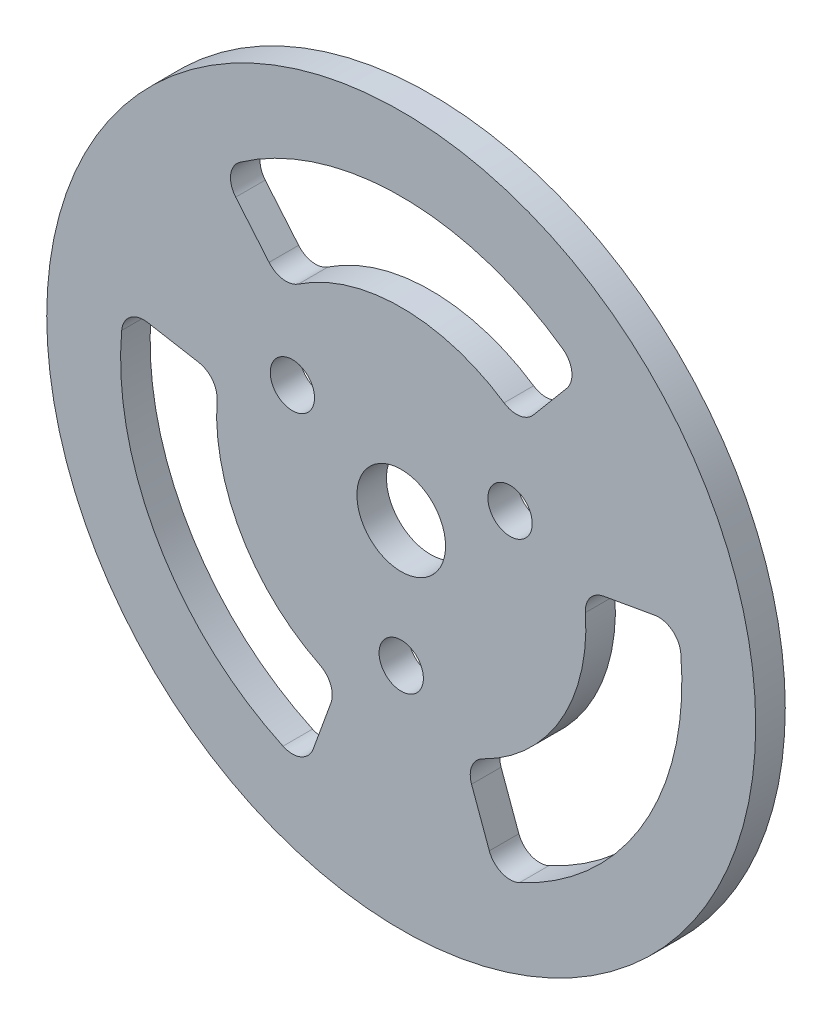
ISO-10303-21;
HEADER;
FILE_DESCRIPTION(('STEP AP214'),'2;1');
FILE_NAME('part.step','',(''),(''),'','','');
FILE_SCHEMA(('AUTOMOTIVE_DESIGN { 1 0 10303 214 1 1 1 1 }'));
ENDSEC;
DATA;
#1=APPLICATION_CONTEXT('core data for automotive mechanical design processes');
#2=APPLICATION_PROTOCOL_DEFINITION('international standard','automotive_design',2000,#1);
#3=PRODUCT_CONTEXT('',#1,'mechanical');
#4=PRODUCT('Part','Part','',(#3));
#5=PRODUCT_RELATED_PRODUCT_CATEGORY('part','',(#4));
#6=PRODUCT_DEFINITION_FORMATION('','',#4);
#7=PRODUCT_DEFINITION_CONTEXT('part definition',#1,'design');
#8=PRODUCT_DEFINITION('design','',#6,#7);
#9=PRODUCT_DEFINITION_SHAPE('','',#8);
#10=(LENGTH_UNIT() NAMED_UNIT(*) SI_UNIT(.MILLI.,.METRE.));
#11=(NAMED_UNIT(*) PLANE_ANGLE_UNIT() SI_UNIT($,.RADIAN.));
#12=(NAMED_UNIT(*) SI_UNIT($,.STERADIAN.) SOLID_ANGLE_UNIT());
#13=UNCERTAINTY_MEASURE_WITH_UNIT(LENGTH_MEASURE(1.E-05),#10,'distance_accuracy_value','');
#14=(GEOMETRIC_REPRESENTATION_CONTEXT(3) GLOBAL_UNCERTAINTY_ASSIGNED_CONTEXT((#13)) GLOBAL_UNIT_ASSIGNED_CONTEXT((#10,
#11,#12)) REPRESENTATION_CONTEXT('',''));
#15=CARTESIAN_POINT('',(0.,0.,0.));
#16=DIRECTION('',(0.,0.,1.));
#17=DIRECTION('',(1.,0.,0.));
#18=AXIS2_PLACEMENT_3D('',#15,#16,#17);
#19=CARTESIAN_POINT('',(0.,0.,2.));
#20=DIRECTION('',(0.,0.,1.));
#21=DIRECTION('',(1.,0.,0.));
#22=AXIS2_PLACEMENT_3D('',#19,#20,#21);
#23=PLANE('',#22);
#24=CARTESIAN_POINT('',(7.3684325591274,4.25416652151843,2.));
#25=DIRECTION('',(0.,0.,1.));
#26=DIRECTION('',(1.,0.,0.));
#27=AXIS2_PLACEMENT_3D('',#24,#25,#26);
#28=CIRCLE('',#27,1.50000000000063);
#29=CARTESIAN_POINT('',(8.86843255912803,4.25416652151843,2.));
#30=VERTEX_POINT('',#29);
#31=EDGE_CURVE('E750',#30,#30,#28,.T.);
#32=ORIENTED_EDGE('',*,*,#31,.F.);
#33=EDGE_LOOP('',(#32));
#34=FACE_BOUND('',#33,.T.);
#35=CARTESIAN_POINT('',(0.,0.,2.));
#36=DIRECTION('',(0.,0.,1.));
#37=DIRECTION('',(1.,0.,0.));
#38=AXIS2_PLACEMENT_3D('',#35,#36,#37);
#39=CIRCLE('',#38,3.);
#40=CARTESIAN_POINT('',(3.,0.,2.));
#41=VERTEX_POINT('',#40);
#42=EDGE_CURVE('E429',#41,#41,#39,.T.);
#43=ORIENTED_EDGE('',*,*,#42,.F.);
#44=EDGE_LOOP('',(#43));
#45=FACE_BOUND('',#44,.T.);
#46=CARTESIAN_POINT('',(0.,0.,2.));
#47=DIRECTION('',(0.,0.,1.));
#48=DIRECTION('',(1.,0.,0.));
#49=AXIS2_PLACEMENT_3D('',#46,#47,#48);
#50=CIRCLE('',#49,24.);
#51=CARTESIAN_POINT('',(24.,0.,2.));
#52=VERTEX_POINT('',#51);
#53=EDGE_CURVE('E230',#52,#52,#50,.T.);
#54=ORIENTED_EDGE('',*,*,#53,.T.);
#55=EDGE_LOOP('',(#54));
#56=FACE_BOUND('',#55,.T.);
#57=CARTESIAN_POINT('',(-7.3684325591274,4.25416652151781,2.));
#58=DIRECTION('',(0.,0.,1.));
#59=DIRECTION('',(1.,0.,0.));
#60=AXIS2_PLACEMENT_3D('',#57,#58,#59);
#61=CIRCLE('',#60,1.5);
#62=CARTESIAN_POINT('',(-5.8684325591274,4.25416652151781,2.));
#63=VERTEX_POINT('',#62);
#64=EDGE_CURVE('E421',#63,#63,#61,.T.);
#65=ORIENTED_EDGE('',*,*,#64,.F.);
#66=EDGE_LOOP('',(#65));
#67=FACE_BOUND('',#66,.T.);
#68=DIRECTION('',(0.642787609686539,0.766044443118978,0.));
#69=VECTOR('',#68,1.);
#70=CARTESIAN_POINT('',(8.03484512108152,9.57555553898741,2.));
#71=LINE('',#70,#69);
#72=CARTESIAN_POINT('',(8.94722486520327,10.6628873768547,2.));
#73=VERTEX_POINT('',#72);
#74=CARTESIAN_POINT('',(11.2073849311345,13.3564412552662,2.));
#75=VERTEX_POINT('',#74);
#76=EDGE_CURVE('E394',#73,#75,#71,.T.);
#77=ORIENTED_EDGE('',*,*,#76,.F.);
#78=CARTESIAN_POINT('',(7.79815820052481,11.6270687913845,2.));
#79=DIRECTION('',(0.,0.,1.));
#80=DIRECTION('',(1.,0.,0.));
#81=AXIS2_PLACEMENT_3D('',#78,#79,#80);
#82=CIRCLE('',#81,1.5);
#83=CARTESIAN_POINT('',(6.96264125046858,10.381311420879,2.));
#84=VERTEX_POINT('',#83);
#85=EDGE_CURVE('E373',#73,#84,#82,.F.);
#86=ORIENTED_EDGE('',*,*,#85,.T.);
#87=CARTESIAN_POINT('',(0.,0.,2.));
#88=DIRECTION('',(0.,0.,-1.));
#89=DIRECTION('',(1.,0.,0.));
#90=AXIS2_PLACEMENT_3D('',#87,#88,#89);
#91=CIRCLE('',#90,12.5);
#92=CARTESIAN_POINT('',(-6.96264125046902,10.3813114208787,2.));
#93=VERTEX_POINT('',#92);
#94=EDGE_CURVE('E398',#93,#84,#91,.T.);
#95=ORIENTED_EDGE('',*,*,#94,.F.);
#96=CARTESIAN_POINT('',(-7.7981582005253,11.6270687913842,2.));
#97=DIRECTION('',(0.,0.,1.));
#98=DIRECTION('',(1.,0.,0.));
#99=AXIS2_PLACEMENT_3D('',#96,#97,#98);
#100=CIRCLE('',#99,1.5);
#101=CARTESIAN_POINT('',(-8.94722486520377,10.6628873768544,2.));
#102=VERTEX_POINT('',#101);
#103=EDGE_CURVE('E367',#93,#102,#100,.F.);
#104=ORIENTED_EDGE('',*,*,#103,.T.);
#105=DIRECTION('',(0.642787609686539,-0.766044443118978,0.));
#106=VECTOR('',#105,1.);
#107=CARTESIAN_POINT('',(-8.03484512108197,9.57555553898704,2.));
#108=LINE('',#107,#106);
#109=CARTESIAN_POINT('',(-11.2073849311349,13.3564412552658,2.));
#110=VERTEX_POINT('',#109);
#111=EDGE_CURVE('E402',#110,#102,#108,.T.);
#112=ORIENTED_EDGE('',*,*,#111,.F.);
#113=CARTESIAN_POINT('',(-10.0583182664565,14.3206226697956,2.));
#114=DIRECTION('',(0.,0.,1.));
#115=DIRECTION('',(1.,0.,0.));
#116=AXIS2_PLACEMENT_3D('',#113,#114,#115);
#117=CIRCLE('',#116,1.5);
#118=CARTESIAN_POINT('',(-10.9204598321528,15.548104612921,2.));
#119=VERTEX_POINT('',#118);
#120=EDGE_CURVE('E361',#110,#119,#117,.F.);
#121=ORIENTED_EDGE('',*,*,#120,.T.);
#122=CARTESIAN_POINT('',(0.,0.,2.));
#123=DIRECTION('',(0.,0.,1.));
#124=DIRECTION('',(1.,0.,0.));
#125=AXIS2_PLACEMENT_3D('',#122,#123,#124);
#126=CIRCLE('',#125,18.9999999999999);
#127=CARTESIAN_POINT('',(10.9204598321522,15.5481046129213,2.));
#128=VERTEX_POINT('',#127);
#129=EDGE_CURVE('E397',#128,#119,#126,.T.);
#130=ORIENTED_EDGE('',*,*,#129,.F.);
#131=CARTESIAN_POINT('',(10.058318266456,14.320622669796,2.));
#132=DIRECTION('',(0.,0.,1.));
#133=DIRECTION('',(1.,0.,0.));
#134=AXIS2_PLACEMENT_3D('',#131,#132,#133);
#135=CIRCLE('',#134,1.5);
#136=EDGE_CURVE('E11',#128,#75,#135,.F.);
#137=ORIENTED_EDGE('',*,*,#136,.T.);
#138=EDGE_LOOP('',(#77,#86,#95,#104,#112,#121,#130,#137));
#139=FACE_BOUND('',#138,.T.);
#140=DIRECTION('',(0.342020143325669,-0.939692620785908,0.));
#141=VECTOR('',#140,1.);
#142=CARTESIAN_POINT('',(4.27525179157306,-11.7461577598229,2.));
#143=LINE('',#142,#141);
#144=CARTESIAN_POINT('',(4.76071891344883,-13.0799677150642,2.));
#145=VERTEX_POINT('',#144);
#146=CARTESIAN_POINT('',(5.96332496564971,-16.3841006879855,2.));
#147=VERTEX_POINT('',#146);
#148=EDGE_CURVE('E793',#145,#147,#143,.T.);
#149=ORIENTED_EDGE('',*,*,#148,.F.);
#150=CARTESIAN_POINT('',(6.17025784462769,-12.5669375000757,2.));
#151=DIRECTION('',(0.,0.,1.));
#152=DIRECTION('',(1.,0.,0.));
#153=AXIS2_PLACEMENT_3D('',#150,#151,#152);
#154=CIRCLE('',#153,1.5);
#155=CARTESIAN_POINT('',(5.50915878984615,-11.2204799107818,2.));
#156=VERTEX_POINT('',#155);
#157=EDGE_CURVE('E355',#145,#156,#154,.F.);
#158=ORIENTED_EDGE('',*,*,#157,.T.);
#159=CARTESIAN_POINT('',(0.,0.,2.));
#160=DIRECTION('',(0.,0.,-1.));
#161=DIRECTION('',(1.,0.,0.));
#162=AXIS2_PLACEMENT_3D('',#159,#160,#161);
#163=CIRCLE('',#162,12.4999999999999);
#164=CARTESIAN_POINT('',(12.4718000403129,0.839168489904891,2.));
#165=VERTEX_POINT('',#164);
#166=EDGE_CURVE('E789',#165,#156,#163,.T.);
#167=ORIENTED_EDGE('',*,*,#166,.F.);
#168=CARTESIAN_POINT('',(13.9684160451504,0.939868708693479,2.));
#169=DIRECTION('',(0.,0.,1.));
#170=DIRECTION('',(1.,0.,0.));
#171=AXIS2_PLACEMENT_3D('',#168,#169,#170);
#172=CIRCLE('',#171,1.5);
#173=CARTESIAN_POINT('',(13.70794377865,2.41708033821179,2.));
#174=VERTEX_POINT('',#173);
#175=EDGE_CURVE('E337',#165,#174,#172,.F.);
#176=ORIENTED_EDGE('',*,*,#175,.T.);
#177=DIRECTION('',(-0.984807753012208,-0.173648177666931,0.));
#178=VECTOR('',#177,1.);
#179=CARTESIAN_POINT('',(12.3100969126524,2.17060222083764,2.));
#180=LINE('',#179,#178);
#181=CARTESIAN_POINT('',(17.1707098967821,3.02765943272159,2.));
#182=VERTEX_POINT('',#181);
#183=EDGE_CURVE('E416',#182,#174,#180,.T.);
#184=ORIENTED_EDGE('',*,*,#183,.F.);
#185=CARTESIAN_POINT('',(17.4311821632825,1.55044780320328,2.));
#186=DIRECTION('',(0.,0.,1.));
#187=DIRECTION('',(1.,0.,0.));
#188=AXIS2_PLACEMENT_3D('',#185,#186,#187);
#189=CIRCLE('',#188,1.5);
#190=CARTESIAN_POINT('',(18.9252834915639,1.68334332919214,2.));
#191=VERTEX_POINT('',#190);
#192=EDGE_CURVE('E343',#182,#191,#189,.F.);
#193=ORIENTED_EDGE('',*,*,#192,.T.);
#194=CARTESIAN_POINT('',(0.,0.,2.));
#195=DIRECTION('',(0.,0.,1.));
#196=DIRECTION('',(1.,0.,0.));
#197=AXIS2_PLACEMENT_3D('',#194,#195,#196);
#198=CIRCLE('',#197,18.9999999999999);
#199=CARTESIAN_POINT('',(8.00482365941388,-17.2314479421111,2.));
#200=VERTEX_POINT('',#199);
#201=EDGE_CURVE('E798',#200,#191,#198,.T.);
#202=ORIENTED_EDGE('',*,*,#201,.F.);
#203=CARTESIAN_POINT('',(7.37286389682857,-15.871070472997,2.));
#204=DIRECTION('',(0.,0.,1.));
#205=DIRECTION('',(1.,0.,0.));
#206=AXIS2_PLACEMENT_3D('',#203,#204,#205);
#207=CIRCLE('',#206,1.5);
#208=EDGE_CURVE('E349',#200,#147,#207,.F.);
#209=ORIENTED_EDGE('',*,*,#208,.T.);
#210=EDGE_LOOP('',(#149,#158,#167,#176,#184,#193,#202,#209));
#211=FACE_BOUND('',#210,.T.);
#212=DIRECTION('',(-0.984807753012208,0.17364817766693,0.));
#213=VECTOR('',#212,1.);
#214=CARTESIAN_POINT('',(-12.3100969126523,2.17060222083553,2.));
#215=LINE('',#214,#213);
#216=CARTESIAN_POINT('',(-13.7079437786498,2.41708033820966,2.));
#217=VERTEX_POINT('',#216);
#218=CARTESIAN_POINT('',(-17.1707098967821,3.0276594327195,2.));
#219=VERTEX_POINT('',#218);
#220=EDGE_CURVE('E770',#217,#219,#215,.T.);
#221=ORIENTED_EDGE('',*,*,#220,.F.);
#222=CARTESIAN_POINT('',(-13.9684160451502,0.939868708691351,2.));
#223=DIRECTION('',(0.,0.,1.));
#224=DIRECTION('',(1.,0.,0.));
#225=AXIS2_PLACEMENT_3D('',#222,#223,#224);
#226=CIRCLE('',#225,1.5);
#227=CARTESIAN_POINT('',(-12.4718000403126,0.839168489902988,2.));
#228=VERTEX_POINT('',#227);
#229=EDGE_CURVE('E214',#217,#228,#226,.F.);
#230=ORIENTED_EDGE('',*,*,#229,.T.);
#231=CARTESIAN_POINT('',(0.,0.,2.));
#232=DIRECTION('',(0.,0.,-1.));
#233=DIRECTION('',(1.,0.,0.));
#234=AXIS2_PLACEMENT_3D('',#231,#232,#233);
#235=CIRCLE('',#234,12.4999999999995);
#236=CARTESIAN_POINT('',(-5.50915878984214,-11.2204799107834,2.));
#237=VERTEX_POINT('',#236);
#238=EDGE_CURVE('E766',#237,#228,#235,.T.);
#239=ORIENTED_EDGE('',*,*,#238,.F.);
#240=CARTESIAN_POINT('',(-6.17025784462322,-12.5669375000774,2.));
#241=DIRECTION('',(0.,0.,1.));
#242=DIRECTION('',(1.,0.,0.));
#243=AXIS2_PLACEMENT_3D('',#240,#241,#242);
#244=CIRCLE('',#243,1.5);
#245=CARTESIAN_POINT('',(-4.76071891344436,-13.079967715066,2.));
#246=VERTEX_POINT('',#245);
#247=EDGE_CURVE('E324',#237,#246,#244,.F.);
#248=ORIENTED_EDGE('',*,*,#247,.T.);
#249=DIRECTION('',(0.342020143325669,0.939692620785908,0.));
#250=VECTOR('',#249,1.);
#251=CARTESIAN_POINT('',(-4.27525179156845,-11.7461577598243,2.));
#252=LINE('',#251,#250);
#253=CARTESIAN_POINT('',(-5.96332496564526,-16.3841006879874,2.));
#254=VERTEX_POINT('',#253);
#255=EDGE_CURVE('E777',#254,#246,#252,.T.);
#256=ORIENTED_EDGE('',*,*,#255,.F.);
#257=CARTESIAN_POINT('',(-7.37286389682412,-15.8710704729989,2.));
#258=DIRECTION('',(0.,0.,1.));
#259=DIRECTION('',(1.,0.,0.));
#260=AXIS2_PLACEMENT_3D('',#257,#258,#259);
#261=CIRCLE('',#260,1.5);
#262=CARTESIAN_POINT('',(-8.00482365940905,-17.2314479421131,2.));
#263=VERTEX_POINT('',#262);
#264=EDGE_CURVE('E318',#254,#263,#261,.F.);
#265=ORIENTED_EDGE('',*,*,#264,.T.);
#266=CARTESIAN_POINT('',(0.,0.,2.));
#267=DIRECTION('',(0.,0.,1.));
#268=DIRECTION('',(1.,0.,0.));
#269=AXIS2_PLACEMENT_3D('',#266,#267,#268);
#270=CIRCLE('',#269,18.9999999999997);
#271=CARTESIAN_POINT('',(-18.9252834915639,1.68334332918986,2.));
#272=VERTEX_POINT('',#271);
#273=EDGE_CURVE('E774',#272,#263,#270,.T.);
#274=ORIENTED_EDGE('',*,*,#273,.F.);
#275=CARTESIAN_POINT('',(-17.4311821632825,1.55044780320119,2.));
#276=DIRECTION('',(0.,0.,1.));
#277=DIRECTION('',(1.,0.,0.));
#278=AXIS2_PLACEMENT_3D('',#275,#276,#277);
#279=CIRCLE('',#278,1.5);
#280=EDGE_CURVE('E213',#272,#219,#279,.F.);
#281=ORIENTED_EDGE('',*,*,#280,.T.);
#282=EDGE_LOOP('',(#221,#230,#239,#248,#256,#265,#274,#281));
#283=FACE_BOUND('',#282,.T.);
#284=CARTESIAN_POINT('',(5.4138210334093E-13,-8.5083330430353,2.));
#285=DIRECTION('',(0.,0.,1.));
#286=DIRECTION('',(1.,0.,0.));
#287=AXIS2_PLACEMENT_3D('',#284,#285,#286);
#288=CIRCLE('',#287,1.50000000000024);
#289=CARTESIAN_POINT('',(1.50000000000078,-8.5083330430353,2.));
#290=VERTEX_POINT('',#289);
#291=EDGE_CURVE('E755',#290,#290,#288,.T.);
#292=ORIENTED_EDGE('',*,*,#291,.F.);
#293=EDGE_LOOP('',(#292));
#294=FACE_BOUND('',#293,.T.);
#295=ADVANCED_FACE('F38',(#34,#45,#56,#67,#139,#211,#283,#294),#23,.T.);
#296=CARTESIAN_POINT('',(0.,0.,0.));
#297=DIRECTION('',(0.,0.,1.));
#298=DIRECTION('',(1.,0.,0.));
#299=AXIS2_PLACEMENT_3D('',#296,#297,#298);
#300=PLANE('',#299);
#301=DIRECTION('',(-0.984807753012208,-0.173648177666931,0.));
#302=VECTOR('',#301,1.);
#303=CARTESIAN_POINT('',(12.3100969126524,2.17060222083764,0.));
#304=LINE('',#303,#302);
#305=CARTESIAN_POINT('',(17.1707098967821,3.02765943272159,0.));
#306=VERTEX_POINT('',#305);
#307=CARTESIAN_POINT('',(13.70794377865,2.41708033821179,0.));
#308=VERTEX_POINT('',#307);
#309=EDGE_CURVE('E794',#306,#308,#304,.T.);
#310=ORIENTED_EDGE('',*,*,#309,.T.);
#311=CARTESIAN_POINT('',(13.9684160451504,0.939868708693479,0.));
#312=DIRECTION('',(0.,0.,1.));
#313=DIRECTION('',(1.,0.,0.));
#314=AXIS2_PLACEMENT_3D('',#311,#312,#313);
#315=CIRCLE('',#314,1.5);
#316=CARTESIAN_POINT('',(12.4718000403129,0.839168489904891,0.));
#317=VERTEX_POINT('',#316);
#318=EDGE_CURVE('E334',#308,#317,#315,.T.);
#319=ORIENTED_EDGE('',*,*,#318,.T.);
#320=CARTESIAN_POINT('',(0.,0.,0.));
#321=DIRECTION('',(0.,0.,-1.));
#322=DIRECTION('',(1.,0.,0.));
#323=AXIS2_PLACEMENT_3D('',#320,#321,#322);
#324=CIRCLE('',#323,12.4999999999999);
#325=CARTESIAN_POINT('',(5.50915878984615,-11.2204799107818,0.));
#326=VERTEX_POINT('',#325);
#327=EDGE_CURVE('E781',#317,#326,#324,.T.);
#328=ORIENTED_EDGE('',*,*,#327,.T.);
#329=CARTESIAN_POINT('',(6.17025784462769,-12.5669375000757,0.));
#330=DIRECTION('',(0.,0.,1.));
#331=DIRECTION('',(1.,0.,0.));
#332=AXIS2_PLACEMENT_3D('',#329,#330,#331);
#333=CIRCLE('',#332,1.5);
#334=CARTESIAN_POINT('',(4.76071891344883,-13.0799677150642,0.));
#335=VERTEX_POINT('',#334);
#336=EDGE_CURVE('E352',#326,#335,#333,.T.);
#337=ORIENTED_EDGE('',*,*,#336,.T.);
#338=DIRECTION('',(0.342020143325669,-0.939692620785908,0.));
#339=VECTOR('',#338,1.);
#340=CARTESIAN_POINT('',(4.27525179157306,-11.7461577598229,0.));
#341=LINE('',#340,#339);
#342=CARTESIAN_POINT('',(5.96332496564971,-16.3841006879855,0.));
#343=VERTEX_POINT('',#342);
#344=EDGE_CURVE('E808',#335,#343,#341,.T.);
#345=ORIENTED_EDGE('',*,*,#344,.T.);
#346=CARTESIAN_POINT('',(7.37286389682857,-15.871070472997,0.));
#347=DIRECTION('',(0.,0.,1.));
#348=DIRECTION('',(1.,0.,0.));
#349=AXIS2_PLACEMENT_3D('',#346,#347,#348);
#350=CIRCLE('',#349,1.5);
#351=CARTESIAN_POINT('',(8.00482365941388,-17.2314479421111,0.));
#352=VERTEX_POINT('',#351);
#353=EDGE_CURVE('E346',#343,#352,#350,.T.);
#354=ORIENTED_EDGE('',*,*,#353,.T.);
#355=CARTESIAN_POINT('',(0.,0.,0.));
#356=DIRECTION('',(0.,0.,1.));
#357=DIRECTION('',(1.,0.,0.));
#358=AXIS2_PLACEMENT_3D('',#355,#356,#357);
#359=CIRCLE('',#358,18.9999999999999);
#360=CARTESIAN_POINT('',(18.9252834915639,1.68334332919214,0.));
#361=VERTEX_POINT('',#360);
#362=EDGE_CURVE('E812',#352,#361,#359,.T.);
#363=ORIENTED_EDGE('',*,*,#362,.T.);
#364=CARTESIAN_POINT('',(17.4311821632825,1.55044780320328,0.));
#365=DIRECTION('',(0.,0.,1.));
#366=DIRECTION('',(1.,0.,0.));
#367=AXIS2_PLACEMENT_3D('',#364,#365,#366);
#368=CIRCLE('',#367,1.5);
#369=EDGE_CURVE('E340',#361,#306,#368,.T.);
#370=ORIENTED_EDGE('',*,*,#369,.T.);
#371=EDGE_LOOP('',(#310,#319,#328,#337,#345,#354,#363,#370));
#372=FACE_BOUND('',#371,.T.);
#373=CARTESIAN_POINT('',(-7.3684325591274,4.25416652151781,0.));
#374=DIRECTION('',(0.,0.,1.));
#375=DIRECTION('',(1.,0.,0.));
#376=AXIS2_PLACEMENT_3D('',#373,#374,#375);
#377=CIRCLE('',#376,1.5);
#378=CARTESIAN_POINT('',(-5.8684325591274,4.25416652151781,0.));
#379=VERTEX_POINT('',#378);
#380=EDGE_CURVE('E411',#379,#379,#377,.T.);
#381=ORIENTED_EDGE('',*,*,#380,.T.);
#382=EDGE_LOOP('',(#381));
#383=FACE_BOUND('',#382,.T.);
#384=CARTESIAN_POINT('',(0.,0.,0.));
#385=DIRECTION('',(0.,0.,1.));
#386=DIRECTION('',(1.,0.,0.));
#387=AXIS2_PLACEMENT_3D('',#384,#385,#386);
#388=CIRCLE('',#387,3.);
#389=CARTESIAN_POINT('',(3.,0.,0.));
#390=VERTEX_POINT('',#389);
#391=EDGE_CURVE('E425',#390,#390,#388,.T.);
#392=ORIENTED_EDGE('',*,*,#391,.T.);
#393=EDGE_LOOP('',(#392));
#394=FACE_BOUND('',#393,.T.);
#395=CARTESIAN_POINT('',(0.,0.,0.));
#396=DIRECTION('',(0.,0.,1.));
#397=DIRECTION('',(1.,0.,0.));
#398=AXIS2_PLACEMENT_3D('',#395,#396,#397);
#399=CIRCLE('',#398,24.);
#400=CARTESIAN_POINT('',(24.,0.,0.));
#401=VERTEX_POINT('',#400);
#402=EDGE_CURVE('E237',#401,#401,#399,.T.);
#403=ORIENTED_EDGE('',*,*,#402,.F.);
#404=EDGE_LOOP('',(#403));
#405=FACE_BOUND('',#404,.T.);
#406=DIRECTION('',(0.642787609686539,-0.766044443118978,0.));
#407=VECTOR('',#406,1.);
#408=CARTESIAN_POINT('',(-8.03484512108197,9.57555553898704,0.));
#409=LINE('',#408,#407);
#410=CARTESIAN_POINT('',(-11.2073849311349,13.3564412552658,0.));
#411=VERTEX_POINT('',#410);
#412=CARTESIAN_POINT('',(-8.94722486520377,10.6628873768544,0.));
#413=VERTEX_POINT('',#412);
#414=EDGE_CURVE('E391',#411,#413,#409,.T.);
#415=ORIENTED_EDGE('',*,*,#414,.T.);
#416=CARTESIAN_POINT('',(-7.7981582005253,11.6270687913842,0.));
#417=DIRECTION('',(0.,0.,1.));
#418=DIRECTION('',(1.,0.,0.));
#419=AXIS2_PLACEMENT_3D('',#416,#417,#418);
#420=CIRCLE('',#419,1.5);
#421=CARTESIAN_POINT('',(-6.96264125046902,10.3813114208787,0.));
#422=VERTEX_POINT('',#421);
#423=EDGE_CURVE('E364',#413,#422,#420,.T.);
#424=ORIENTED_EDGE('',*,*,#423,.T.);
#425=CARTESIAN_POINT('',(0.,0.,0.));
#426=DIRECTION('',(0.,0.,-1.));
#427=DIRECTION('',(1.,0.,0.));
#428=AXIS2_PLACEMENT_3D('',#425,#426,#427);
#429=CIRCLE('',#428,12.5);
#430=CARTESIAN_POINT('',(6.96264125046858,10.381311420879,0.));
#431=VERTEX_POINT('',#430);
#432=EDGE_CURVE('E412',#422,#431,#429,.T.);
#433=ORIENTED_EDGE('',*,*,#432,.T.);
#434=CARTESIAN_POINT('',(7.79815820052481,11.6270687913845,0.));
#435=DIRECTION('',(0.,0.,1.));
#436=DIRECTION('',(1.,0.,0.));
#437=AXIS2_PLACEMENT_3D('',#434,#435,#436);
#438=CIRCLE('',#437,1.5);
#439=CARTESIAN_POINT('',(8.94722486520327,10.6628873768547,0.));
#440=VERTEX_POINT('',#439);
#441=EDGE_CURVE('E370',#431,#440,#438,.T.);
#442=ORIENTED_EDGE('',*,*,#441,.T.);
#443=DIRECTION('',(0.642787609686539,0.766044443118978,0.));
#444=VECTOR('',#443,1.);
#445=CARTESIAN_POINT('',(8.03484512108152,9.57555553898741,0.));
#446=LINE('',#445,#444);
#447=CARTESIAN_POINT('',(11.2073849311345,13.3564412552662,0.));
#448=VERTEX_POINT('',#447);
#449=EDGE_CURVE('E382',#440,#448,#446,.T.);
#450=ORIENTED_EDGE('',*,*,#449,.T.);
#451=CARTESIAN_POINT('',(10.058318266456,14.320622669796,0.));
#452=DIRECTION('',(0.,0.,1.));
#453=DIRECTION('',(1.,0.,0.));
#454=AXIS2_PLACEMENT_3D('',#451,#452,#453);
#455=CIRCLE('',#454,1.5);
#456=CARTESIAN_POINT('',(10.9204598321522,15.5481046129213,0.));
#457=VERTEX_POINT('',#456);
#458=EDGE_CURVE('E47',#448,#457,#455,.T.);
#459=ORIENTED_EDGE('',*,*,#458,.T.);
#460=CARTESIAN_POINT('',(0.,0.,0.));
#461=DIRECTION('',(0.,0.,1.));
#462=DIRECTION('',(1.,0.,0.));
#463=AXIS2_PLACEMENT_3D('',#460,#461,#462);
#464=CIRCLE('',#463,18.9999999999999);
#465=CARTESIAN_POINT('',(-10.9204598321528,15.548104612921,0.));
#466=VERTEX_POINT('',#465);
#467=EDGE_CURVE('E381',#457,#466,#464,.T.);
#468=ORIENTED_EDGE('',*,*,#467,.T.);
#469=CARTESIAN_POINT('',(-10.0583182664565,14.3206226697956,0.));
#470=DIRECTION('',(0.,0.,1.));
#471=DIRECTION('',(1.,0.,0.));
#472=AXIS2_PLACEMENT_3D('',#469,#470,#471);
#473=CIRCLE('',#472,1.5);
#474=EDGE_CURVE('E358',#466,#411,#473,.T.);
#475=ORIENTED_EDGE('',*,*,#474,.T.);
#476=EDGE_LOOP('',(#415,#424,#433,#442,#450,#459,#468,#475));
#477=FACE_BOUND('',#476,.T.);
#478=DIRECTION('',(0.342020143325669,0.939692620785908,0.));
#479=VECTOR('',#478,1.);
#480=CARTESIAN_POINT('',(-4.27525179156845,-11.7461577598243,0.));
#481=LINE('',#480,#479);
#482=CARTESIAN_POINT('',(-5.96332496564526,-16.3841006879874,0.));
#483=VERTEX_POINT('',#482);
#484=CARTESIAN_POINT('',(-4.76071891344436,-13.079967715066,0.));
#485=VERTEX_POINT('',#484);
#486=EDGE_CURVE('E225',#483,#485,#481,.T.);
#487=ORIENTED_EDGE('',*,*,#486,.T.);
#488=CARTESIAN_POINT('',(-6.17025784462322,-12.5669375000774,0.));
#489=DIRECTION('',(0.,0.,1.));
#490=DIRECTION('',(1.,0.,0.));
#491=AXIS2_PLACEMENT_3D('',#488,#489,#490);
#492=CIRCLE('',#491,1.5);
#493=CARTESIAN_POINT('',(-5.50915878984214,-11.2204799107834,0.));
#494=VERTEX_POINT('',#493);
#495=EDGE_CURVE('E321',#485,#494,#492,.T.);
#496=ORIENTED_EDGE('',*,*,#495,.T.);
#497=CARTESIAN_POINT('',(0.,0.,0.));
#498=DIRECTION('',(0.,0.,-1.));
#499=DIRECTION('',(1.,0.,0.));
#500=AXIS2_PLACEMENT_3D('',#497,#498,#499);
#501=CIRCLE('',#500,12.4999999999995);
#502=CARTESIAN_POINT('',(-12.4718000403126,0.839168489902988,0.));
#503=VERTEX_POINT('',#502);
#504=EDGE_CURVE('E759',#494,#503,#501,.T.);
#505=ORIENTED_EDGE('',*,*,#504,.T.);
#506=CARTESIAN_POINT('',(-13.9684160451502,0.939868708691351,0.));
#507=DIRECTION('',(0.,0.,1.));
#508=DIRECTION('',(1.,0.,0.));
#509=AXIS2_PLACEMENT_3D('',#506,#507,#508);
#510=CIRCLE('',#509,1.5);
#511=CARTESIAN_POINT('',(-13.7079437786498,2.41708033820966,0.));
#512=VERTEX_POINT('',#511);
#513=EDGE_CURVE('E327',#503,#512,#510,.T.);
#514=ORIENTED_EDGE('',*,*,#513,.T.);
#515=DIRECTION('',(-0.984807753012208,0.17364817766693,0.));
#516=VECTOR('',#515,1.);
#517=CARTESIAN_POINT('',(-12.3100969126523,2.17060222083553,0.));
#518=LINE('',#517,#516);
#519=CARTESIAN_POINT('',(-17.1707098967821,3.0276594327195,0.));
#520=VERTEX_POINT('',#519);
#521=EDGE_CURVE('E207',#512,#520,#518,.T.);
#522=ORIENTED_EDGE('',*,*,#521,.T.);
#523=CARTESIAN_POINT('',(-17.4311821632825,1.55044780320119,0.));
#524=DIRECTION('',(0.,0.,1.));
#525=DIRECTION('',(1.,0.,0.));
#526=AXIS2_PLACEMENT_3D('',#523,#524,#525);
#527=CIRCLE('',#526,1.5);
#528=CARTESIAN_POINT('',(-18.9252834915639,1.68334332918986,0.));
#529=VERTEX_POINT('',#528);
#530=EDGE_CURVE('E200',#520,#529,#527,.T.);
#531=ORIENTED_EDGE('',*,*,#530,.T.);
#532=CARTESIAN_POINT('',(0.,0.,0.));
#533=DIRECTION('',(0.,0.,1.));
#534=DIRECTION('',(1.,0.,0.));
#535=AXIS2_PLACEMENT_3D('',#532,#533,#534);
#536=CIRCLE('',#535,18.9999999999997);
#537=CARTESIAN_POINT('',(-8.00482365940905,-17.2314479421131,0.));
#538=VERTEX_POINT('',#537);
#539=EDGE_CURVE('E205',#529,#538,#536,.T.);
#540=ORIENTED_EDGE('',*,*,#539,.T.);
#541=CARTESIAN_POINT('',(-7.37286389682412,-15.8710704729989,0.));
#542=DIRECTION('',(0.,0.,1.));
#543=DIRECTION('',(1.,0.,0.));
#544=AXIS2_PLACEMENT_3D('',#541,#542,#543);
#545=CIRCLE('',#544,1.5);
#546=EDGE_CURVE('E315',#538,#483,#545,.T.);
#547=ORIENTED_EDGE('',*,*,#546,.T.);
#548=EDGE_LOOP('',(#487,#496,#505,#514,#522,#531,#540,#547));
#549=FACE_BOUND('',#548,.T.);
#550=CARTESIAN_POINT('',(7.3684325591274,4.25416652151843,0.));
#551=DIRECTION('',(0.,0.,1.));
#552=DIRECTION('',(1.,0.,0.));
#553=AXIS2_PLACEMENT_3D('',#550,#551,#552);
#554=CIRCLE('',#553,1.50000000000063);
#555=CARTESIAN_POINT('',(8.86843255912803,4.25416652151843,0.));
#556=VERTEX_POINT('',#555);
#557=EDGE_CURVE('E753',#556,#556,#554,.T.);
#558=ORIENTED_EDGE('',*,*,#557,.T.);
#559=EDGE_LOOP('',(#558));
#560=FACE_BOUND('',#559,.T.);
#561=CARTESIAN_POINT('',(5.4138210334093E-13,-8.5083330430353,0.));
#562=DIRECTION('',(0.,0.,1.));
#563=DIRECTION('',(1.,0.,0.));
#564=AXIS2_PLACEMENT_3D('',#561,#562,#563);
#565=CIRCLE('',#564,1.50000000000024);
#566=CARTESIAN_POINT('',(1.50000000000078,-8.5083330430353,0.));
#567=VERTEX_POINT('',#566);
#568=EDGE_CURVE('E762',#567,#567,#565,.T.);
#569=ORIENTED_EDGE('',*,*,#568,.T.);
#570=EDGE_LOOP('',(#569));
#571=FACE_BOUND('',#570,.T.);
#572=ADVANCED_FACE('F203',(#372,#383,#394,#405,#477,#549,#560,#571),#300,.F.);
#573=CARTESIAN_POINT('',(0.,0.,2.));
#574=DIRECTION('',(0.,0.,-1.));
#575=DIRECTION('',(-1.,0.,0.));
#576=AXIS2_PLACEMENT_3D('',#573,#574,#575);
#577=CYLINDRICAL_SURFACE('',#576,24.);
#578=ORIENTED_EDGE('',*,*,#53,.F.);
#579=EDGE_LOOP('',(#578));
#580=FACE_BOUND('',#579,.T.);
#581=ORIENTED_EDGE('',*,*,#402,.T.);
#582=EDGE_LOOP('',(#581));
#583=FACE_BOUND('',#582,.T.);
#584=ADVANCED_FACE('F442',(#580,#583),#577,.T.);
#585=CARTESIAN_POINT('',(0.,0.,2.));
#586=DIRECTION('',(0.,0.,-1.));
#587=DIRECTION('',(-1.,0.,0.));
#588=AXIS2_PLACEMENT_3D('',#585,#586,#587);
#589=CYLINDRICAL_SURFACE('',#588,3.);
#590=ORIENTED_EDGE('',*,*,#42,.T.);
#591=EDGE_LOOP('',(#590));
#592=FACE_BOUND('',#591,.T.);
#593=ORIENTED_EDGE('',*,*,#391,.F.);
#594=EDGE_LOOP('',(#593));
#595=FACE_BOUND('',#594,.T.);
#596=ADVANCED_FACE('F439',(#592,#595),#589,.F.);
#597=CARTESIAN_POINT('',(-7.3684325591274,4.25416652151781,2.));
#598=DIRECTION('',(0.,0.,-1.));
#599=DIRECTION('',(-1.,0.,0.));
#600=AXIS2_PLACEMENT_3D('',#597,#598,#599);
#601=CYLINDRICAL_SURFACE('',#600,1.5);
#602=ORIENTED_EDGE('',*,*,#64,.T.);
#603=EDGE_LOOP('',(#602));
#604=FACE_BOUND('',#603,.T.);
#605=ORIENTED_EDGE('',*,*,#380,.F.);
#606=EDGE_LOOP('',(#605));
#607=FACE_BOUND('',#606,.T.);
#608=ADVANCED_FACE('F441',(#604,#607),#601,.F.);
#609=CARTESIAN_POINT('',(0.,0.,2.));
#610=DIRECTION('',(0.,0.,-1.));
#611=DIRECTION('',(-1.,0.,0.));
#612=AXIS2_PLACEMENT_3D('',#609,#610,#611);
#613=CYLINDRICAL_SURFACE('',#612,12.5);
#614=ORIENTED_EDGE('',*,*,#432,.F.);
#615=DIRECTION('',(0.,0.,-1.));
#616=VECTOR('',#615,1.);
#617=CARTESIAN_POINT('',(-6.96264125046902,10.3813114208787,2.));
#618=LINE('',#617,#616);
#619=EDGE_CURVE('E306',#422,#93,#618,.F.);
#620=ORIENTED_EDGE('',*,*,#619,.T.);
#621=ORIENTED_EDGE('',*,*,#94,.T.);
#622=DIRECTION('',(0.,0.,-1.));
#623=VECTOR('',#622,1.);
#624=CARTESIAN_POINT('',(6.96264125046858,10.381311420879,2.));
#625=LINE('',#624,#623);
#626=EDGE_CURVE('E302',#84,#431,#625,.T.);
#627=ORIENTED_EDGE('',*,*,#626,.T.);
#628=EDGE_LOOP('',(#614,#620,#621,#627));
#629=FACE_BOUND('',#628,.T.);
#630=ADVANCED_FACE('F449',(#629),#613,.T.);
#631=CARTESIAN_POINT('',(8.03484512108152,9.57555553898741,2.));
#632=DIRECTION('',(-0.766044443118978,0.642787609686539,0.));
#633=DIRECTION('',(-0.642787609686539,-0.766044443118978,0.));
#634=AXIS2_PLACEMENT_3D('',#631,#632,#633);
#635=PLANE('',#634);
#636=ORIENTED_EDGE('',*,*,#449,.F.);
#637=DIRECTION('',(0.,0.,1.));
#638=VECTOR('',#637,1.);
#639=CARTESIAN_POINT('',(8.94722486520327,10.6628873768547,2.));
#640=LINE('',#639,#638);
#641=EDGE_CURVE('E59',#440,#73,#640,.T.);
#642=ORIENTED_EDGE('',*,*,#641,.T.);
#643=ORIENTED_EDGE('',*,*,#76,.T.);
#644=DIRECTION('',(0.,0.,1.));
#645=VECTOR('',#644,1.);
#646=CARTESIAN_POINT('',(11.2073849311345,13.3564412552662,0.));
#647=LINE('',#646,#645);
#648=EDGE_CURVE('E309',#75,#448,#647,.F.);
#649=ORIENTED_EDGE('',*,*,#648,.T.);
#650=EDGE_LOOP('',(#636,#642,#643,#649));
#651=FACE_BOUND('',#650,.T.);
#652=ADVANCED_FACE('F393',(#651),#635,.T.);
#653=CARTESIAN_POINT('',(0.,0.,2.));
#654=DIRECTION('',(0.,0.,-1.));
#655=DIRECTION('',(-1.,0.,0.));
#656=AXIS2_PLACEMENT_3D('',#653,#654,#655);
#657=CYLINDRICAL_SURFACE('',#656,18.9999999999999);
#658=ORIENTED_EDGE('',*,*,#129,.T.);
#659=DIRECTION('',(0.,0.,-1.));
#660=VECTOR('',#659,1.);
#661=CARTESIAN_POINT('',(-10.9204598321528,15.548104612921,2.));
#662=LINE('',#661,#660);
#663=EDGE_CURVE('E291',#119,#466,#662,.T.);
#664=ORIENTED_EDGE('',*,*,#663,.T.);
#665=ORIENTED_EDGE('',*,*,#467,.F.);
#666=DIRECTION('',(0.,0.,-1.));
#667=VECTOR('',#666,1.);
#668=CARTESIAN_POINT('',(10.9204598321522,15.5481046129214,2.));
#669=LINE('',#668,#667);
#670=EDGE_CURVE('E288',#457,#128,#669,.F.);
#671=ORIENTED_EDGE('',*,*,#670,.T.);
#672=EDGE_LOOP('',(#658,#664,#665,#671));
#673=FACE_BOUND('',#672,.T.);
#674=ADVANCED_FACE('F388',(#673),#657,.F.);
#675=CARTESIAN_POINT('',(-8.03484512108197,9.57555553898704,2.));
#676=DIRECTION('',(0.766044443118978,0.642787609686539,0.));
#677=DIRECTION('',(-0.642787609686539,0.766044443118978,0.));
#678=AXIS2_PLACEMENT_3D('',#675,#676,#677);
#679=PLANE('',#678);
#680=ORIENTED_EDGE('',*,*,#414,.F.);
#681=DIRECTION('',(0.,0.,1.));
#682=VECTOR('',#681,1.);
#683=CARTESIAN_POINT('',(-11.2073849311349,13.3564412552658,2.));
#684=LINE('',#683,#682);
#685=EDGE_CURVE('E299',#411,#110,#684,.T.);
#686=ORIENTED_EDGE('',*,*,#685,.T.);
#687=ORIENTED_EDGE('',*,*,#111,.T.);
#688=DIRECTION('',(0.,0.,1.));
#689=VECTOR('',#688,1.);
#690=CARTESIAN_POINT('',(-8.94722486520377,10.6628873768544,0.));
#691=LINE('',#690,#689);
#692=EDGE_CURVE('E295',#102,#413,#691,.F.);
#693=ORIENTED_EDGE('',*,*,#692,.T.);
#694=EDGE_LOOP('',(#680,#686,#687,#693));
#695=FACE_BOUND('',#694,.T.);
#696=ADVANCED_FACE('F521',(#695),#679,.T.);
#697=CARTESIAN_POINT('',(0.,0.,2.));
#698=DIRECTION('',(0.,0.,-1.));
#699=DIRECTION('',(-1.,0.,0.));
#700=AXIS2_PLACEMENT_3D('',#697,#698,#699);
#701=CYLINDRICAL_SURFACE('',#700,12.4999999999999);
#702=ORIENTED_EDGE('',*,*,#327,.F.);
#703=DIRECTION('',(0.,0.,-1.));
#704=VECTOR('',#703,1.);
#705=CARTESIAN_POINT('',(12.4718000403129,0.839168489904891,2.));
#706=LINE('',#705,#704);
#707=EDGE_CURVE('E271',#317,#165,#706,.F.);
#708=ORIENTED_EDGE('',*,*,#707,.T.);
#709=ORIENTED_EDGE('',*,*,#166,.T.);
#710=DIRECTION('',(0.,0.,-1.));
#711=VECTOR('',#710,1.);
#712=CARTESIAN_POINT('',(5.50915878984615,-11.2204799107818,2.));
#713=LINE('',#712,#711);
#714=EDGE_CURVE('E267',#156,#326,#713,.T.);
#715=ORIENTED_EDGE('',*,*,#714,.T.);
#716=EDGE_LOOP('',(#702,#708,#709,#715));
#717=FACE_BOUND('',#716,.T.);
#718=ADVANCED_FACE('F524',(#717),#701,.T.);
#719=CARTESIAN_POINT('',(4.27525179157306,-11.7461577598229,2.));
#720=DIRECTION('',(0.939692620785908,0.342020143325669,0.));
#721=DIRECTION('',(-0.342020143325669,0.939692620785909,0.));
#722=AXIS2_PLACEMENT_3D('',#719,#720,#721);
#723=PLANE('',#722);
#724=ORIENTED_EDGE('',*,*,#148,.T.);
#725=DIRECTION('',(0.,0.,1.));
#726=VECTOR('',#725,1.);
#727=CARTESIAN_POINT('',(5.96332496564971,-16.3841006879855,0.));
#728=LINE('',#727,#726);
#729=EDGE_CURVE('E284',#147,#343,#728,.F.);
#730=ORIENTED_EDGE('',*,*,#729,.T.);
#731=ORIENTED_EDGE('',*,*,#344,.F.);
#732=DIRECTION('',(0.,0.,1.));
#733=VECTOR('',#732,1.);
#734=CARTESIAN_POINT('',(4.76071891344883,-13.0799677150642,2.));
#735=LINE('',#734,#733);
#736=EDGE_CURVE('E281',#335,#145,#735,.T.);
#737=ORIENTED_EDGE('',*,*,#736,.T.);
#738=EDGE_LOOP('',(#724,#730,#731,#737));
#739=FACE_BOUND('',#738,.T.);
#740=ADVANCED_FACE('F530',(#739),#723,.T.);
#741=CARTESIAN_POINT('',(0.,0.,2.));
#742=DIRECTION('',(0.,0.,-1.));
#743=DIRECTION('',(-1.,0.,0.));
#744=AXIS2_PLACEMENT_3D('',#741,#742,#743);
#745=CYLINDRICAL_SURFACE('',#744,18.9999999999999);
#746=ORIENTED_EDGE('',*,*,#201,.T.);
#747=DIRECTION('',(0.,0.,-1.));
#748=VECTOR('',#747,1.);
#749=CARTESIAN_POINT('',(18.9252834915639,1.68334332919214,2.));
#750=LINE('',#749,#748);
#751=EDGE_CURVE('E277',#191,#361,#750,.T.);
#752=ORIENTED_EDGE('',*,*,#751,.T.);
#753=ORIENTED_EDGE('',*,*,#362,.F.);
#754=DIRECTION('',(0.,0.,-1.));
#755=VECTOR('',#754,1.);
#756=CARTESIAN_POINT('',(8.00482365941388,-17.2314479421111,2.));
#757=LINE('',#756,#755);
#758=EDGE_CURVE('E274',#352,#200,#757,.F.);
#759=ORIENTED_EDGE('',*,*,#758,.T.);
#760=EDGE_LOOP('',(#746,#752,#753,#759));
#761=FACE_BOUND('',#760,.T.);
#762=ADVANCED_FACE('F571',(#761),#745,.F.);
#763=CARTESIAN_POINT('',(12.3100969126524,2.17060222083764,2.));
#764=DIRECTION('',(0.173648177666931,-0.984807753012208,0.));
#765=DIRECTION('',(0.984807753012208,0.173648177666931,0.));
#766=AXIS2_PLACEMENT_3D('',#763,#764,#765);
#767=PLANE('',#766);
#768=ORIENTED_EDGE('',*,*,#183,.T.);
#769=DIRECTION('',(0.,0.,1.));
#770=VECTOR('',#769,1.);
#771=CARTESIAN_POINT('',(13.70794377865,2.41708033821179,0.));
#772=LINE('',#771,#770);
#773=EDGE_CURVE('E263',#174,#308,#772,.F.);
#774=ORIENTED_EDGE('',*,*,#773,.T.);
#775=ORIENTED_EDGE('',*,*,#309,.F.);
#776=DIRECTION('',(0.,0.,1.));
#777=VECTOR('',#776,1.);
#778=CARTESIAN_POINT('',(17.1707098967821,3.02765943272159,2.));
#779=LINE('',#778,#777);
#780=EDGE_CURVE('E260',#306,#182,#779,.T.);
#781=ORIENTED_EDGE('',*,*,#780,.T.);
#782=EDGE_LOOP('',(#768,#774,#775,#781));
#783=FACE_BOUND('',#782,.T.);
#784=ADVANCED_FACE('F580',(#783),#767,.T.);
#785=CARTESIAN_POINT('',(0.,0.,2.));
#786=DIRECTION('',(0.,0.,-1.));
#787=DIRECTION('',(-1.,0.,0.));
#788=AXIS2_PLACEMENT_3D('',#785,#786,#787);
#789=CYLINDRICAL_SURFACE('',#788,12.4999999999995);
#790=ORIENTED_EDGE('',*,*,#504,.F.);
#791=DIRECTION('',(0.,0.,-1.));
#792=VECTOR('',#791,1.);
#793=CARTESIAN_POINT('',(-5.50915878984214,-11.2204799107834,2.));
#794=LINE('',#793,#792);
#795=EDGE_CURVE('E251',#494,#237,#794,.F.);
#796=ORIENTED_EDGE('',*,*,#795,.T.);
#797=ORIENTED_EDGE('',*,*,#238,.T.);
#798=DIRECTION('',(0.,0.,-1.));
#799=VECTOR('',#798,1.);
#800=CARTESIAN_POINT('',(-12.4718000403126,0.839168489902988,2.));
#801=LINE('',#800,#799);
#802=EDGE_CURVE('E247',#228,#503,#801,.T.);
#803=ORIENTED_EDGE('',*,*,#802,.T.);
#804=EDGE_LOOP('',(#790,#796,#797,#803));
#805=FACE_BOUND('',#804,.T.);
#806=ADVANCED_FACE('F590',(#805),#789,.T.);
#807=CARTESIAN_POINT('',(-12.3100969126523,2.17060222083553,2.));
#808=DIRECTION('',(-0.17364817766693,-0.984807753012208,0.));
#809=DIRECTION('',(0.984807753012208,-0.17364817766693,0.));
#810=AXIS2_PLACEMENT_3D('',#807,#808,#809);
#811=PLANE('',#810);
#812=ORIENTED_EDGE('',*,*,#521,.F.);
#813=DIRECTION('',(0.,0.,1.));
#814=VECTOR('',#813,1.);
#815=CARTESIAN_POINT('',(-13.7079437786498,2.41708033820966,2.));
#816=LINE('',#815,#814);
#817=EDGE_CURVE('E257',#512,#217,#816,.T.);
#818=ORIENTED_EDGE('',*,*,#817,.T.);
#819=ORIENTED_EDGE('',*,*,#220,.T.);
#820=DIRECTION('',(0.,0.,1.));
#821=VECTOR('',#820,1.);
#822=CARTESIAN_POINT('',(-17.1707098967821,3.0276594327195,0.));
#823=LINE('',#822,#821);
#824=EDGE_CURVE('E254',#219,#520,#823,.F.);
#825=ORIENTED_EDGE('',*,*,#824,.T.);
#826=EDGE_LOOP('',(#812,#818,#819,#825));
#827=FACE_BOUND('',#826,.T.);
#828=ADVANCED_FACE('F600',(#827),#811,.T.);
#829=CARTESIAN_POINT('',(0.,0.,2.));
#830=DIRECTION('',(0.,0.,-1.));
#831=DIRECTION('',(-1.,0.,0.));
#832=AXIS2_PLACEMENT_3D('',#829,#830,#831);
#833=CYLINDRICAL_SURFACE('',#832,18.9999999999997);
#834=ORIENTED_EDGE('',*,*,#273,.T.);
#835=DIRECTION('',(0.,0.,-1.));
#836=VECTOR('',#835,1.);
#837=CARTESIAN_POINT('',(-8.00482365940905,-17.2314479421131,2.));
#838=LINE('',#837,#836);
#839=EDGE_CURVE('E223',#263,#538,#838,.T.);
#840=ORIENTED_EDGE('',*,*,#839,.T.);
#841=ORIENTED_EDGE('',*,*,#539,.F.);
#842=DIRECTION('',(0.,0.,-1.));
#843=VECTOR('',#842,1.);
#844=CARTESIAN_POINT('',(-18.9252834915639,1.68334332918986,2.));
#845=LINE('',#844,#843);
#846=EDGE_CURVE('E220',#529,#272,#845,.F.);
#847=ORIENTED_EDGE('',*,*,#846,.T.);
#848=EDGE_LOOP('',(#834,#840,#841,#847));
#849=FACE_BOUND('',#848,.T.);
#850=ADVANCED_FACE('F219',(#849),#833,.F.);
#851=CARTESIAN_POINT('',(-4.27525179156845,-11.7461577598243,2.));
#852=DIRECTION('',(-0.939692620785908,0.342020143325669,0.));
#853=DIRECTION('',(-0.342020143325669,-0.939692620785908,0.));
#854=AXIS2_PLACEMENT_3D('',#851,#852,#853);
#855=PLANE('',#854);
#856=ORIENTED_EDGE('',*,*,#486,.F.);
#857=DIRECTION('',(0.,0.,1.));
#858=VECTOR('',#857,1.);
#859=CARTESIAN_POINT('',(-5.96332496564525,-16.3841006879874,2.));
#860=LINE('',#859,#858);
#861=EDGE_CURVE('E244',#483,#254,#860,.T.);
#862=ORIENTED_EDGE('',*,*,#861,.T.);
#863=ORIENTED_EDGE('',*,*,#255,.T.);
#864=DIRECTION('',(0.,0.,1.));
#865=VECTOR('',#864,1.);
#866=CARTESIAN_POINT('',(-4.76071891344436,-13.079967715066,0.));
#867=LINE('',#866,#865);
#868=EDGE_CURVE('E234',#246,#485,#867,.F.);
#869=ORIENTED_EDGE('',*,*,#868,.T.);
#870=EDGE_LOOP('',(#856,#862,#863,#869));
#871=FACE_BOUND('',#870,.T.);
#872=ADVANCED_FACE('F619',(#871),#855,.T.);
#873=CARTESIAN_POINT('',(7.3684325591274,4.25416652151843,2.));
#874=DIRECTION('',(0.,0.,-1.));
#875=DIRECTION('',(-1.,0.,0.));
#876=AXIS2_PLACEMENT_3D('',#873,#874,#875);
#877=CYLINDRICAL_SURFACE('',#876,1.50000000000063);
#878=ORIENTED_EDGE('',*,*,#31,.T.);
#879=EDGE_LOOP('',(#878));
#880=FACE_BOUND('',#879,.T.);
#881=ORIENTED_EDGE('',*,*,#557,.F.);
#882=EDGE_LOOP('',(#881));
#883=FACE_BOUND('',#882,.T.);
#884=ADVANCED_FACE('F628',(#880,#883),#877,.F.);
#885=CARTESIAN_POINT('',(5.4138210334093E-13,-8.5083330430353,2.));
#886=DIRECTION('',(0.,0.,-1.));
#887=DIRECTION('',(-1.,0.,0.));
#888=AXIS2_PLACEMENT_3D('',#885,#886,#887);
#889=CYLINDRICAL_SURFACE('',#888,1.50000000000024);
#890=ORIENTED_EDGE('',*,*,#291,.T.);
#891=EDGE_LOOP('',(#890));
#892=FACE_BOUND('',#891,.T.);
#893=ORIENTED_EDGE('',*,*,#568,.F.);
#894=EDGE_LOOP('',(#893));
#895=FACE_BOUND('',#894,.T.);
#896=ADVANCED_FACE('F469',(#892,#895),#889,.F.);
#897=CARTESIAN_POINT('',(-7.37286389682412,-15.8710704729989,2.));
#898=DIRECTION('',(0.,0.,-1.));
#899=DIRECTION('',(-1.,0.,0.));
#900=AXIS2_PLACEMENT_3D('',#897,#898,#899);
#901=CYLINDRICAL_SURFACE('',#900,1.5);
#902=ORIENTED_EDGE('',*,*,#264,.F.);
#903=ORIENTED_EDGE('',*,*,#861,.F.);
#904=ORIENTED_EDGE('',*,*,#546,.F.);
#905=ORIENTED_EDGE('',*,*,#839,.F.);
#906=EDGE_LOOP('',(#902,#903,#904,#905));
#907=FACE_BOUND('',#906,.T.);
#908=ADVANCED_FACE('F465',(#907),#901,.F.);
#909=CARTESIAN_POINT('',(-6.17025784462322,-12.5669375000774,2.));
#910=DIRECTION('',(0.,0.,-1.));
#911=DIRECTION('',(-1.,0.,0.));
#912=AXIS2_PLACEMENT_3D('',#909,#910,#911);
#913=CYLINDRICAL_SURFACE('',#912,1.5);
#914=ORIENTED_EDGE('',*,*,#247,.F.);
#915=ORIENTED_EDGE('',*,*,#795,.F.);
#916=ORIENTED_EDGE('',*,*,#495,.F.);
#917=ORIENTED_EDGE('',*,*,#868,.F.);
#918=EDGE_LOOP('',(#914,#915,#916,#917));
#919=FACE_BOUND('',#918,.T.);
#920=ADVANCED_FACE('F468',(#919),#913,.F.);
#921=CARTESIAN_POINT('',(-13.9684160451502,0.939868708691351,2.));
#922=DIRECTION('',(0.,0.,-1.));
#923=DIRECTION('',(-1.,0.,0.));
#924=AXIS2_PLACEMENT_3D('',#921,#922,#923);
#925=CYLINDRICAL_SURFACE('',#924,1.5);
#926=ORIENTED_EDGE('',*,*,#229,.F.);
#927=ORIENTED_EDGE('',*,*,#817,.F.);
#928=ORIENTED_EDGE('',*,*,#513,.F.);
#929=ORIENTED_EDGE('',*,*,#802,.F.);
#930=EDGE_LOOP('',(#926,#927,#928,#929));
#931=FACE_BOUND('',#930,.T.);
#932=ADVANCED_FACE('F473',(#931),#925,.F.);
#933=CARTESIAN_POINT('',(-17.4311821632825,1.55044780320119,2.));
#934=DIRECTION('',(0.,0.,-1.));
#935=DIRECTION('',(-1.,0.,0.));
#936=AXIS2_PLACEMENT_3D('',#933,#934,#935);
#937=CYLINDRICAL_SURFACE('',#936,1.5);
#938=ORIENTED_EDGE('',*,*,#280,.F.);
#939=ORIENTED_EDGE('',*,*,#846,.F.);
#940=ORIENTED_EDGE('',*,*,#530,.F.);
#941=ORIENTED_EDGE('',*,*,#824,.F.);
#942=EDGE_LOOP('',(#938,#939,#940,#941));
#943=FACE_BOUND('',#942,.T.);
#944=ADVANCED_FACE('F228',(#943),#937,.F.);
#945=CARTESIAN_POINT('',(13.9684160451504,0.939868708693479,2.));
#946=DIRECTION('',(0.,0.,-1.));
#947=DIRECTION('',(-1.,0.,0.));
#948=AXIS2_PLACEMENT_3D('',#945,#946,#947);
#949=CYLINDRICAL_SURFACE('',#948,1.5);
#950=ORIENTED_EDGE('',*,*,#175,.F.);
#951=ORIENTED_EDGE('',*,*,#707,.F.);
#952=ORIENTED_EDGE('',*,*,#318,.F.);
#953=ORIENTED_EDGE('',*,*,#773,.F.);
#954=EDGE_LOOP('',(#950,#951,#952,#953));
#955=FACE_BOUND('',#954,.T.);
#956=ADVANCED_FACE('F480',(#955),#949,.F.);
#957=CARTESIAN_POINT('',(17.4311821632825,1.55044780320328,2.));
#958=DIRECTION('',(0.,0.,-1.));
#959=DIRECTION('',(-1.,0.,0.));
#960=AXIS2_PLACEMENT_3D('',#957,#958,#959);
#961=CYLINDRICAL_SURFACE('',#960,1.5);
#962=ORIENTED_EDGE('',*,*,#192,.F.);
#963=ORIENTED_EDGE('',*,*,#780,.F.);
#964=ORIENTED_EDGE('',*,*,#369,.F.);
#965=ORIENTED_EDGE('',*,*,#751,.F.);
#966=EDGE_LOOP('',(#962,#963,#964,#965));
#967=FACE_BOUND('',#966,.T.);
#968=ADVANCED_FACE('F483',(#967),#961,.F.);
#969=CARTESIAN_POINT('',(7.37286389682857,-15.871070472997,2.));
#970=DIRECTION('',(0.,0.,-1.));
#971=DIRECTION('',(-1.,0.,0.));
#972=AXIS2_PLACEMENT_3D('',#969,#970,#971);
#973=CYLINDRICAL_SURFACE('',#972,1.5);
#974=ORIENTED_EDGE('',*,*,#208,.F.);
#975=ORIENTED_EDGE('',*,*,#758,.F.);
#976=ORIENTED_EDGE('',*,*,#353,.F.);
#977=ORIENTED_EDGE('',*,*,#729,.F.);
#978=EDGE_LOOP('',(#974,#975,#976,#977));
#979=FACE_BOUND('',#978,.T.);
#980=ADVANCED_FACE('F487',(#979),#973,.F.);
#981=CARTESIAN_POINT('',(6.17025784462769,-12.5669375000757,2.));
#982=DIRECTION('',(0.,0.,-1.));
#983=DIRECTION('',(-1.,0.,0.));
#984=AXIS2_PLACEMENT_3D('',#981,#982,#983);
#985=CYLINDRICAL_SURFACE('',#984,1.5);
#986=ORIENTED_EDGE('',*,*,#157,.F.);
#987=ORIENTED_EDGE('',*,*,#736,.F.);
#988=ORIENTED_EDGE('',*,*,#336,.F.);
#989=ORIENTED_EDGE('',*,*,#714,.F.);
#990=EDGE_LOOP('',(#986,#987,#988,#989));
#991=FACE_BOUND('',#990,.T.);
#992=ADVANCED_FACE('F491',(#991),#985,.F.);
#993=CARTESIAN_POINT('',(-10.0583182664565,14.3206226697956,2.));
#994=DIRECTION('',(0.,0.,-1.));
#995=DIRECTION('',(-1.,0.,0.));
#996=AXIS2_PLACEMENT_3D('',#993,#994,#995);
#997=CYLINDRICAL_SURFACE('',#996,1.5);
#998=ORIENTED_EDGE('',*,*,#120,.F.);
#999=ORIENTED_EDGE('',*,*,#685,.F.);
#1000=ORIENTED_EDGE('',*,*,#474,.F.);
#1001=ORIENTED_EDGE('',*,*,#663,.F.);
#1002=EDGE_LOOP('',(#998,#999,#1000,#1001));
#1003=FACE_BOUND('',#1002,.T.);
#1004=ADVANCED_FACE('F495',(#1003),#997,.F.);
#1005=CARTESIAN_POINT('',(-7.7981582005253,11.6270687913842,2.));
#1006=DIRECTION('',(0.,0.,-1.));
#1007=DIRECTION('',(-1.,0.,0.));
#1008=AXIS2_PLACEMENT_3D('',#1005,#1006,#1007);
#1009=CYLINDRICAL_SURFACE('',#1008,1.5);
#1010=ORIENTED_EDGE('',*,*,#103,.F.);
#1011=ORIENTED_EDGE('',*,*,#619,.F.);
#1012=ORIENTED_EDGE('',*,*,#423,.F.);
#1013=ORIENTED_EDGE('',*,*,#692,.F.);
#1014=EDGE_LOOP('',(#1010,#1011,#1012,#1013));
#1015=FACE_BOUND('',#1014,.T.);
#1016=ADVANCED_FACE('F499',(#1015),#1009,.F.);
#1017=CARTESIAN_POINT('',(7.79815820052481,11.6270687913845,2.));
#1018=DIRECTION('',(0.,0.,-1.));
#1019=DIRECTION('',(-1.,0.,0.));
#1020=AXIS2_PLACEMENT_3D('',#1017,#1018,#1019);
#1021=CYLINDRICAL_SURFACE('',#1020,1.5);
#1022=ORIENTED_EDGE('',*,*,#85,.F.);
#1023=ORIENTED_EDGE('',*,*,#641,.F.);
#1024=ORIENTED_EDGE('',*,*,#441,.F.);
#1025=ORIENTED_EDGE('',*,*,#626,.F.);
#1026=EDGE_LOOP('',(#1022,#1023,#1024,#1025));
#1027=FACE_BOUND('',#1026,.T.);
#1028=ADVANCED_FACE('F502',(#1027),#1021,.F.);
#1029=CARTESIAN_POINT('',(10.058318266456,14.320622669796,2.));
#1030=DIRECTION('',(0.,0.,-1.));
#1031=DIRECTION('',(-1.,0.,0.));
#1032=AXIS2_PLACEMENT_3D('',#1029,#1030,#1031);
#1033=CYLINDRICAL_SURFACE('',#1032,1.5);
#1034=ORIENTED_EDGE('',*,*,#136,.F.);
#1035=ORIENTED_EDGE('',*,*,#670,.F.);
#1036=ORIENTED_EDGE('',*,*,#458,.F.);
#1037=ORIENTED_EDGE('',*,*,#648,.F.);
#1038=EDGE_LOOP('',(#1034,#1035,#1036,#1037));
#1039=FACE_BOUND('',#1038,.T.);
#1040=ADVANCED_FACE('F40',(#1039),#1033,.F.);
#1041=CLOSED_SHELL('',(#295,#572,#584,#596,#608,#630,#652,#674,#696,#718,#740,#762,#784,#806,
#828,#850,#872,#884,#896,#908,#920,#932,#944,#956,#968,#980,#992,#1004,#1016,#1028,#1040));
#1042=MANIFOLD_SOLID_BREP('B2',#1041);
#1043=ADVANCED_BREP_SHAPE_REPRESENTATION('',(#18,#1042),#14);
#1044=SHAPE_DEFINITION_REPRESENTATION(#9,#1043);
ENDSEC;
END-ISO-10303-21;
